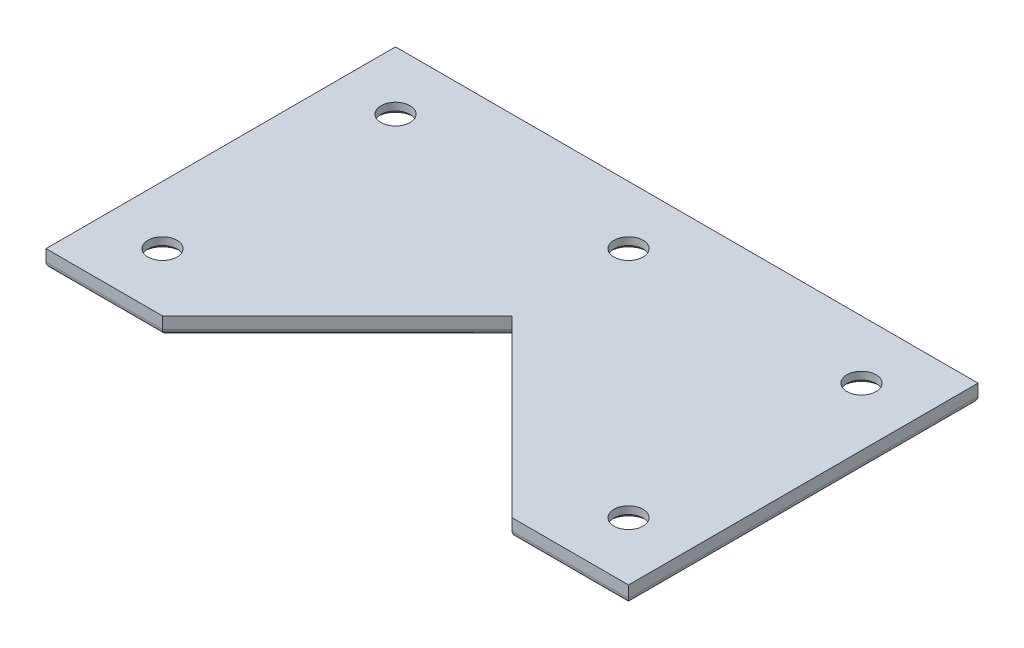
ISO-10303-21;
HEADER;
FILE_DESCRIPTION(('STEP AP214'),'2;1');
FILE_NAME('part.step','',(''),(''),'','','');
FILE_SCHEMA(('AUTOMOTIVE_DESIGN { 1 0 10303 214 1 1 1 1 }'));
ENDSEC;
DATA;
#1=APPLICATION_CONTEXT('core data for automotive mechanical design processes');
#2=APPLICATION_PROTOCOL_DEFINITION('international standard','automotive_design',2000,#1);
#3=PRODUCT_CONTEXT('',#1,'mechanical');
#4=PRODUCT('Part','Part','',(#3));
#5=PRODUCT_RELATED_PRODUCT_CATEGORY('part','',(#4));
#6=PRODUCT_DEFINITION_FORMATION('','',#4);
#7=PRODUCT_DEFINITION_CONTEXT('part definition',#1,'design');
#8=PRODUCT_DEFINITION('design','',#6,#7);
#9=PRODUCT_DEFINITION_SHAPE('','',#8);
#10=(LENGTH_UNIT() NAMED_UNIT(*) SI_UNIT(.MILLI.,.METRE.));
#11=(NAMED_UNIT(*) PLANE_ANGLE_UNIT() SI_UNIT($,.RADIAN.));
#12=(NAMED_UNIT(*) SI_UNIT($,.STERADIAN.) SOLID_ANGLE_UNIT());
#13=UNCERTAINTY_MEASURE_WITH_UNIT(LENGTH_MEASURE(1.E-05),#10,'distance_accuracy_value','');
#14=(GEOMETRIC_REPRESENTATION_CONTEXT(3) GLOBAL_UNCERTAINTY_ASSIGNED_CONTEXT((#13)) GLOBAL_UNIT_ASSIGNED_CONTEXT((#10,
#11,#12)) REPRESENTATION_CONTEXT('',''));
#15=CARTESIAN_POINT('',(0.,0.,0.));
#16=DIRECTION('',(0.,0.,1.));
#17=DIRECTION('',(1.,0.,0.));
#18=AXIS2_PLACEMENT_3D('',#15,#16,#17);
#19=CARTESIAN_POINT('',(-40.,3.,50.));
#20=DIRECTION('',(0.,-1.,0.));
#21=DIRECTION('',(0.,0.,-1.));
#22=AXIS2_PLACEMENT_3D('',#19,#20,#21);
#23=CYLINDRICAL_SURFACE('',#22,2.5);
#24=CARTESIAN_POINT('',(-40.,1.7,50.));
#25=DIRECTION('',(0.,-1.,0.));
#26=DIRECTION('',(0.,0.,-1.));
#27=AXIS2_PLACEMENT_3D('',#24,#25,#26);
#28=CIRCLE('',#27,2.5);
#29=CARTESIAN_POINT('',(-40.,1.7,47.5));
#30=VERTEX_POINT('',#29);
#31=EDGE_CURVE('E11',#30,#30,#28,.T.);
#32=ORIENTED_EDGE('',*,*,#31,.T.);
#33=EDGE_LOOP('',(#32));
#34=FACE_BOUND('',#33,.T.);
#35=CARTESIAN_POINT('',(-40.,3.,50.));
#36=DIRECTION('',(0.,-1.,0.));
#37=DIRECTION('',(0.,0.,-1.));
#38=AXIS2_PLACEMENT_3D('',#35,#36,#37);
#39=CIRCLE('',#38,2.5);
#40=CARTESIAN_POINT('',(-40.,3.,47.5));
#41=VERTEX_POINT('',#40);
#42=EDGE_CURVE('E24',#41,#41,#39,.T.);
#43=ORIENTED_EDGE('',*,*,#42,.F.);
#44=EDGE_LOOP('',(#43));
#45=FACE_BOUND('',#44,.T.);
#46=ADVANCED_FACE('F17',(#34,#45),#23,.F.);
#47=CARTESIAN_POINT('',(-40.,3.,10.));
#48=DIRECTION('',(0.,-1.,0.));
#49=DIRECTION('',(0.,0.,-1.));
#50=AXIS2_PLACEMENT_3D('',#47,#48,#49);
#51=CYLINDRICAL_SURFACE('',#50,2.5);
#52=CARTESIAN_POINT('',(-40.,1.7,10.));
#53=DIRECTION('',(0.,-1.,0.));
#54=DIRECTION('',(0.,0.,-1.));
#55=AXIS2_PLACEMENT_3D('',#52,#53,#54);
#56=CIRCLE('',#55,2.5);
#57=CARTESIAN_POINT('',(-40.,1.7,7.5));
#58=VERTEX_POINT('',#57);
#59=EDGE_CURVE('E211',#58,#58,#56,.T.);
#60=ORIENTED_EDGE('',*,*,#59,.T.);
#61=EDGE_LOOP('',(#60));
#62=FACE_BOUND('',#61,.T.);
#63=CARTESIAN_POINT('',(-40.,3.,10.));
#64=DIRECTION('',(0.,1.,0.));
#65=DIRECTION('',(0.,0.,-1.));
#66=AXIS2_PLACEMENT_3D('',#63,#64,#65);
#67=CIRCLE('',#66,2.5);
#68=CARTESIAN_POINT('',(-40.,3.,7.5));
#69=VERTEX_POINT('',#68);
#70=EDGE_CURVE('E208',#69,#69,#67,.T.);
#71=ORIENTED_EDGE('',*,*,#70,.T.);
#72=EDGE_LOOP('',(#71));
#73=FACE_BOUND('',#72,.T.);
#74=ADVANCED_FACE('F220',(#62,#73),#51,.F.);
#75=CARTESIAN_POINT('',(0.,3.,10.));
#76=DIRECTION('',(0.,-1.,0.));
#77=DIRECTION('',(0.,0.,-1.));
#78=AXIS2_PLACEMENT_3D('',#75,#76,#77);
#79=CYLINDRICAL_SURFACE('',#78,2.5);
#80=CARTESIAN_POINT('',(0.,1.7,10.));
#81=DIRECTION('',(0.,-1.,0.));
#82=DIRECTION('',(0.,0.,-1.));
#83=AXIS2_PLACEMENT_3D('',#80,#81,#82);
#84=CIRCLE('',#83,2.5);
#85=CARTESIAN_POINT('',(0.,1.7,7.5));
#86=VERTEX_POINT('',#85);
#87=EDGE_CURVE('E205',#86,#86,#84,.T.);
#88=ORIENTED_EDGE('',*,*,#87,.T.);
#89=EDGE_LOOP('',(#88));
#90=FACE_BOUND('',#89,.T.);
#91=CARTESIAN_POINT('',(0.,3.,10.));
#92=DIRECTION('',(0.,-1.,0.));
#93=DIRECTION('',(0.,0.,-1.));
#94=AXIS2_PLACEMENT_3D('',#91,#92,#93);
#95=CIRCLE('',#94,2.5);
#96=CARTESIAN_POINT('',(0.,3.,7.5));
#97=VERTEX_POINT('',#96);
#98=EDGE_CURVE('E202',#97,#97,#95,.T.);
#99=ORIENTED_EDGE('',*,*,#98,.F.);
#100=EDGE_LOOP('',(#99));
#101=FACE_BOUND('',#100,.T.);
#102=ADVANCED_FACE('F226',(#90,#101),#79,.F.);
#103=CARTESIAN_POINT('',(40.,3.,10.));
#104=DIRECTION('',(0.,-1.,0.));
#105=DIRECTION('',(0.,0.,-1.));
#106=AXIS2_PLACEMENT_3D('',#103,#104,#105);
#107=CYLINDRICAL_SURFACE('',#106,2.5);
#108=CARTESIAN_POINT('',(40.,1.7,10.));
#109=DIRECTION('',(0.,-1.,0.));
#110=DIRECTION('',(0.,0.,-1.));
#111=AXIS2_PLACEMENT_3D('',#108,#109,#110);
#112=CIRCLE('',#111,2.5);
#113=CARTESIAN_POINT('',(40.,1.7,7.5));
#114=VERTEX_POINT('',#113);
#115=EDGE_CURVE('E199',#114,#114,#112,.T.);
#116=ORIENTED_EDGE('',*,*,#115,.T.);
#117=EDGE_LOOP('',(#116));
#118=FACE_BOUND('',#117,.T.);
#119=CARTESIAN_POINT('',(40.,3.,10.));
#120=DIRECTION('',(0.,-1.,0.));
#121=DIRECTION('',(0.,0.,-1.));
#122=AXIS2_PLACEMENT_3D('',#119,#120,#121);
#123=CIRCLE('',#122,2.5);
#124=CARTESIAN_POINT('',(40.,3.,7.5));
#125=VERTEX_POINT('',#124);
#126=EDGE_CURVE('E196',#125,#125,#123,.T.);
#127=ORIENTED_EDGE('',*,*,#126,.F.);
#128=EDGE_LOOP('',(#127));
#129=FACE_BOUND('',#128,.T.);
#130=ADVANCED_FACE('F357',(#118,#129),#107,.F.);
#131=CARTESIAN_POINT('',(40.,3.,50.));
#132=DIRECTION('',(0.,-1.,0.));
#133=DIRECTION('',(0.,0.,-1.));
#134=AXIS2_PLACEMENT_3D('',#131,#132,#133);
#135=CYLINDRICAL_SURFACE('',#134,2.5);
#136=CARTESIAN_POINT('',(40.,1.7,50.));
#137=DIRECTION('',(0.,-1.,0.));
#138=DIRECTION('',(0.,0.,-1.));
#139=AXIS2_PLACEMENT_3D('',#136,#137,#138);
#140=CIRCLE('',#139,2.5);
#141=CARTESIAN_POINT('',(40.,1.7,47.5));
#142=VERTEX_POINT('',#141);
#143=EDGE_CURVE('E193',#142,#142,#140,.T.);
#144=ORIENTED_EDGE('',*,*,#143,.T.);
#145=EDGE_LOOP('',(#144));
#146=FACE_BOUND('',#145,.T.);
#147=CARTESIAN_POINT('',(40.,3.,50.));
#148=DIRECTION('',(0.,1.,0.));
#149=DIRECTION('',(0.,0.,-1.));
#150=AXIS2_PLACEMENT_3D('',#147,#148,#149);
#151=CIRCLE('',#150,2.5);
#152=CARTESIAN_POINT('',(40.,3.,47.5));
#153=VERTEX_POINT('',#152);
#154=EDGE_CURVE('E190',#153,#153,#151,.T.);
#155=ORIENTED_EDGE('',*,*,#154,.T.);
#156=EDGE_LOOP('',(#155));
#157=FACE_BOUND('',#156,.T.);
#158=ADVANCED_FACE('F354',(#146,#157),#135,.F.);
#159=CARTESIAN_POINT('',(-50.,3.,30.));
#160=DIRECTION('',(1.,0.,0.));
#161=DIRECTION('',(0.,0.,-1.));
#162=AXIS2_PLACEMENT_3D('',#159,#160,#161);
#163=PLANE('',#162);
#164=DIRECTION('',(0.,-1.,0.));
#165=VECTOR('',#164,1.);
#166=CARTESIAN_POINT('',(-50.,3.,0.));
#167=LINE('',#166,#165);
#168=CARTESIAN_POINT('',(-50.,3.,0.));
#169=VERTEX_POINT('',#168);
#170=CARTESIAN_POINT('',(-50.,1.,0.));
#171=VERTEX_POINT('',#170);
#172=EDGE_CURVE('E31',#169,#171,#167,.T.);
#173=ORIENTED_EDGE('',*,*,#172,.T.);
#174=DIRECTION('',(0.,0.,1.));
#175=VECTOR('',#174,1.);
#176=CARTESIAN_POINT('',(-50.,1.,60.));
#177=LINE('',#176,#175);
#178=CARTESIAN_POINT('',(-50.,1.,60.));
#179=VERTEX_POINT('',#178);
#180=EDGE_CURVE('E36',#171,#179,#177,.T.);
#181=ORIENTED_EDGE('',*,*,#180,.T.);
#182=DIRECTION('',(0.,-1.,0.));
#183=VECTOR('',#182,1.);
#184=CARTESIAN_POINT('',(-50.,3.,60.));
#185=LINE('',#184,#183);
#186=CARTESIAN_POINT('',(-50.,3.,60.));
#187=VERTEX_POINT('',#186);
#188=EDGE_CURVE('E186',#187,#179,#185,.T.);
#189=ORIENTED_EDGE('',*,*,#188,.F.);
#190=DIRECTION('',(0.,0.,1.));
#191=VECTOR('',#190,1.);
#192=CARTESIAN_POINT('',(-50.,3.,30.));
#193=LINE('',#192,#191);
#194=EDGE_CURVE('E183',#169,#187,#193,.T.);
#195=ORIENTED_EDGE('',*,*,#194,.F.);
#196=EDGE_LOOP('',(#173,#181,#189,#195));
#197=FACE_BOUND('',#196,.T.);
#198=ADVANCED_FACE('F350',(#197),#163,.F.);
#199=CARTESIAN_POINT('',(0.,3.,0.));
#200=DIRECTION('',(0.,0.,-1.));
#201=DIRECTION('',(-1.,0.,0.));
#202=AXIS2_PLACEMENT_3D('',#199,#200,#201);
#203=PLANE('',#202);
#204=DIRECTION('',(0.,-1.,0.));
#205=VECTOR('',#204,1.);
#206=CARTESIAN_POINT('',(50.,3.,0.));
#207=LINE('',#206,#205);
#208=CARTESIAN_POINT('',(50.,3.,0.));
#209=VERTEX_POINT('',#208);
#210=CARTESIAN_POINT('',(50.,1.,0.));
#211=VERTEX_POINT('',#210);
#212=EDGE_CURVE('E181',#209,#211,#207,.T.);
#213=ORIENTED_EDGE('',*,*,#212,.T.);
#214=DIRECTION('',(1.,0.,0.));
#215=VECTOR('',#214,1.);
#216=CARTESIAN_POINT('',(0.,1.,0.));
#217=LINE('',#216,#215);
#218=EDGE_CURVE('E179',#211,#171,#217,.F.);
#219=ORIENTED_EDGE('',*,*,#218,.T.);
#220=ORIENTED_EDGE('',*,*,#172,.F.);
#221=DIRECTION('',(1.,0.,0.));
#222=VECTOR('',#221,1.);
#223=CARTESIAN_POINT('',(0.,3.,0.));
#224=LINE('',#223,#222);
#225=EDGE_CURVE('E177',#169,#209,#224,.T.);
#226=ORIENTED_EDGE('',*,*,#225,.T.);
#227=EDGE_LOOP('',(#213,#219,#220,#226));
#228=FACE_BOUND('',#227,.T.);
#229=ADVANCED_FACE('F346',(#228),#203,.T.);
#230=CARTESIAN_POINT('',(50.,3.,30.));
#231=DIRECTION('',(1.,0.,0.));
#232=DIRECTION('',(0.,0.,-1.));
#233=AXIS2_PLACEMENT_3D('',#230,#231,#232);
#234=PLANE('',#233);
#235=DIRECTION('',(0.,-1.,0.));
#236=VECTOR('',#235,1.);
#237=CARTESIAN_POINT('',(50.,3.,60.));
#238=LINE('',#237,#236);
#239=CARTESIAN_POINT('',(50.,3.,60.));
#240=VERTEX_POINT('',#239);
#241=CARTESIAN_POINT('',(50.,1.,60.));
#242=VERTEX_POINT('',#241);
#243=EDGE_CURVE('E175',#240,#242,#238,.T.);
#244=ORIENTED_EDGE('',*,*,#243,.T.);
#245=DIRECTION('',(0.,0.,1.));
#246=VECTOR('',#245,1.);
#247=CARTESIAN_POINT('',(50.,1.,30.));
#248=LINE('',#247,#246);
#249=EDGE_CURVE('E172',#242,#211,#248,.F.);
#250=ORIENTED_EDGE('',*,*,#249,.T.);
#251=ORIENTED_EDGE('',*,*,#212,.F.);
#252=DIRECTION('',(0.,0.,1.));
#253=VECTOR('',#252,1.);
#254=CARTESIAN_POINT('',(50.,3.,30.));
#255=LINE('',#254,#253);
#256=EDGE_CURVE('E170',#209,#240,#255,.T.);
#257=ORIENTED_EDGE('',*,*,#256,.T.);
#258=EDGE_LOOP('',(#244,#250,#251,#257));
#259=FACE_BOUND('',#258,.T.);
#260=ADVANCED_FACE('F342',(#259),#234,.T.);
#261=CARTESIAN_POINT('',(40.,3.,60.));
#262=DIRECTION('',(0.,0.,1.));
#263=DIRECTION('',(1.,0.,0.));
#264=AXIS2_PLACEMENT_3D('',#261,#262,#263);
#265=PLANE('',#264);
#266=DIRECTION('',(0.,-1.,0.));
#267=VECTOR('',#266,1.);
#268=CARTESIAN_POINT('',(30.,3.,60.));
#269=LINE('',#268,#267);
#270=CARTESIAN_POINT('',(30.,3.,60.));
#271=VERTEX_POINT('',#270);
#272=CARTESIAN_POINT('',(30.,1.,60.));
#273=VERTEX_POINT('',#272);
#274=EDGE_CURVE('E168',#271,#273,#269,.T.);
#275=ORIENTED_EDGE('',*,*,#274,.T.);
#276=DIRECTION('',(-1.,0.,0.));
#277=VECTOR('',#276,1.);
#278=CARTESIAN_POINT('',(40.,1.,60.));
#279=LINE('',#278,#277);
#280=EDGE_CURVE('E112',#273,#242,#279,.F.);
#281=ORIENTED_EDGE('',*,*,#280,.T.);
#282=ORIENTED_EDGE('',*,*,#243,.F.);
#283=DIRECTION('',(-1.,0.,0.));
#284=VECTOR('',#283,1.);
#285=CARTESIAN_POINT('',(40.,3.,60.));
#286=LINE('',#285,#284);
#287=EDGE_CURVE('E165',#240,#271,#286,.T.);
#288=ORIENTED_EDGE('',*,*,#287,.T.);
#289=EDGE_LOOP('',(#275,#281,#282,#288));
#290=FACE_BOUND('',#289,.T.);
#291=ADVANCED_FACE('F338',(#290),#265,.T.);
#292=CARTESIAN_POINT('',(15.,3.,45.));
#293=DIRECTION('',(0.707106781186548,0.,-0.707106781186548));
#294=DIRECTION('',(-0.707106781186548,0.,-0.707106781186548));
#295=AXIS2_PLACEMENT_3D('',#292,#293,#294);
#296=PLANE('',#295);
#297=DIRECTION('',(0.,-1.,0.));
#298=VECTOR('',#297,1.);
#299=CARTESIAN_POINT('',(0.,3.,30.));
#300=LINE('',#299,#298);
#301=CARTESIAN_POINT('',(0.,3.,30.));
#302=VERTEX_POINT('',#301);
#303=CARTESIAN_POINT('',(0.,1.,30.));
#304=VERTEX_POINT('',#303);
#305=EDGE_CURVE('E163',#302,#304,#300,.T.);
#306=ORIENTED_EDGE('',*,*,#305,.T.);
#307=DIRECTION('',(0.707106781186548,0.,0.707106781186548));
#308=VECTOR('',#307,1.);
#309=CARTESIAN_POINT('',(30.,1.,60.));
#310=LINE('',#309,#308);
#311=EDGE_CURVE('E160',#304,#273,#310,.T.);
#312=ORIENTED_EDGE('',*,*,#311,.T.);
#313=ORIENTED_EDGE('',*,*,#274,.F.);
#314=DIRECTION('',(0.707106781186548,0.,0.707106781186548));
#315=VECTOR('',#314,1.);
#316=CARTESIAN_POINT('',(15.,3.,45.));
#317=LINE('',#316,#315);
#318=EDGE_CURVE('E157',#302,#271,#317,.T.);
#319=ORIENTED_EDGE('',*,*,#318,.F.);
#320=EDGE_LOOP('',(#306,#312,#313,#319));
#321=FACE_BOUND('',#320,.T.);
#322=ADVANCED_FACE('F334',(#321),#296,.F.);
#323=CARTESIAN_POINT('',(-15.,3.,45.));
#324=DIRECTION('',(-0.707106781186547,0.,-0.707106781186548));
#325=DIRECTION('',(-0.707106781186548,0.,0.707106781186547));
#326=AXIS2_PLACEMENT_3D('',#323,#324,#325);
#327=PLANE('',#326);
#328=DIRECTION('',(0.,-1.,0.));
#329=VECTOR('',#328,1.);
#330=CARTESIAN_POINT('',(-30.,3.,60.));
#331=LINE('',#330,#329);
#332=CARTESIAN_POINT('',(-30.,3.,60.));
#333=VERTEX_POINT('',#332);
#334=CARTESIAN_POINT('',(-30.,1.,60.));
#335=VERTEX_POINT('',#334);
#336=EDGE_CURVE('E155',#333,#335,#331,.T.);
#337=ORIENTED_EDGE('',*,*,#336,.T.);
#338=DIRECTION('',(0.707106781186548,0.,-0.707106781186547));
#339=VECTOR('',#338,1.);
#340=CARTESIAN_POINT('',(0.,1.,30.));
#341=LINE('',#340,#339);
#342=EDGE_CURVE('E152',#335,#304,#341,.T.);
#343=ORIENTED_EDGE('',*,*,#342,.T.);
#344=ORIENTED_EDGE('',*,*,#305,.F.);
#345=DIRECTION('',(0.707106781186548,0.,-0.707106781186547));
#346=VECTOR('',#345,1.);
#347=CARTESIAN_POINT('',(-15.,3.,45.));
#348=LINE('',#347,#346);
#349=EDGE_CURVE('E149',#333,#302,#348,.T.);
#350=ORIENTED_EDGE('',*,*,#349,.F.);
#351=EDGE_LOOP('',(#337,#343,#344,#350));
#352=FACE_BOUND('',#351,.T.);
#353=ADVANCED_FACE('F330',(#352),#327,.F.);
#354=CARTESIAN_POINT('',(-40.,3.,60.));
#355=DIRECTION('',(0.,0.,-1.));
#356=DIRECTION('',(-1.,0.,0.));
#357=AXIS2_PLACEMENT_3D('',#354,#355,#356);
#358=PLANE('',#357);
#359=ORIENTED_EDGE('',*,*,#188,.T.);
#360=DIRECTION('',(1.,0.,0.));
#361=VECTOR('',#360,1.);
#362=CARTESIAN_POINT('',(-30.,1.,60.));
#363=LINE('',#362,#361);
#364=EDGE_CURVE('E146',#179,#335,#363,.T.);
#365=ORIENTED_EDGE('',*,*,#364,.T.);
#366=ORIENTED_EDGE('',*,*,#336,.F.);
#367=DIRECTION('',(1.,0.,0.));
#368=VECTOR('',#367,1.);
#369=CARTESIAN_POINT('',(-40.,3.,60.));
#370=LINE('',#369,#368);
#371=EDGE_CURVE('E143',#187,#333,#370,.T.);
#372=ORIENTED_EDGE('',*,*,#371,.F.);
#373=EDGE_LOOP('',(#359,#365,#366,#372));
#374=FACE_BOUND('',#373,.T.);
#375=ADVANCED_FACE('F326',(#374),#358,.F.);
#376=CARTESIAN_POINT('',(0.,3.,30.));
#377=DIRECTION('',(0.,-1.,0.));
#378=DIRECTION('',(1.,0.,0.));
#379=AXIS2_PLACEMENT_3D('',#376,#377,#378);
#380=PLANE('',#379);
#381=ORIENTED_EDGE('',*,*,#154,.F.);
#382=EDGE_LOOP('',(#381));
#383=FACE_BOUND('',#382,.T.);
#384=ORIENTED_EDGE('',*,*,#126,.T.);
#385=EDGE_LOOP('',(#384));
#386=FACE_BOUND('',#385,.T.);
#387=ORIENTED_EDGE('',*,*,#98,.T.);
#388=EDGE_LOOP('',(#387));
#389=FACE_BOUND('',#388,.T.);
#390=ORIENTED_EDGE('',*,*,#70,.F.);
#391=EDGE_LOOP('',(#390));
#392=FACE_BOUND('',#391,.T.);
#393=ORIENTED_EDGE('',*,*,#42,.T.);
#394=EDGE_LOOP('',(#393));
#395=FACE_BOUND('',#394,.T.);
#396=ORIENTED_EDGE('',*,*,#194,.T.);
#397=ORIENTED_EDGE('',*,*,#371,.T.);
#398=ORIENTED_EDGE('',*,*,#349,.T.);
#399=ORIENTED_EDGE('',*,*,#318,.T.);
#400=ORIENTED_EDGE('',*,*,#287,.F.);
#401=ORIENTED_EDGE('',*,*,#256,.F.);
#402=ORIENTED_EDGE('',*,*,#225,.F.);
#403=EDGE_LOOP('',(#396,#397,#398,#399,#400,#401,#402));
#404=FACE_BOUND('',#403,.T.);
#405=ADVANCED_FACE('F216',(#383,#386,#389,#392,#395,#404),#380,.F.);
#406=CARTESIAN_POINT('',(0.,0.,30.));
#407=DIRECTION('',(0.,-1.,0.));
#408=DIRECTION('',(1.,0.,0.));
#409=AXIS2_PLACEMENT_3D('',#406,#407,#408);
#410=PLANE('',#409);
#411=CARTESIAN_POINT('',(40.,0.,50.));
#412=DIRECTION('',(0.,-1.,0.));
#413=DIRECTION('',(0.,0.,-1.));
#414=AXIS2_PLACEMENT_3D('',#411,#412,#413);
#415=CIRCLE('',#414,4.95);
#416=CARTESIAN_POINT('',(40.,0.,45.05));
#417=VERTEX_POINT('',#416);
#418=EDGE_CURVE('E140',#417,#417,#415,.F.);
#419=ORIENTED_EDGE('',*,*,#418,.T.);
#420=EDGE_LOOP('',(#419));
#421=FACE_BOUND('',#420,.T.);
#422=CARTESIAN_POINT('',(40.,0.,10.));
#423=DIRECTION('',(0.,-1.,0.));
#424=DIRECTION('',(0.,0.,-1.));
#425=AXIS2_PLACEMENT_3D('',#422,#423,#424);
#426=CIRCLE('',#425,4.95);
#427=CARTESIAN_POINT('',(40.,0.,5.05));
#428=VERTEX_POINT('',#427);
#429=EDGE_CURVE('E137',#428,#428,#426,.F.);
#430=ORIENTED_EDGE('',*,*,#429,.T.);
#431=EDGE_LOOP('',(#430));
#432=FACE_BOUND('',#431,.T.);
#433=CARTESIAN_POINT('',(0.,0.,10.));
#434=DIRECTION('',(0.,-1.,0.));
#435=DIRECTION('',(0.,0.,-1.));
#436=AXIS2_PLACEMENT_3D('',#433,#434,#435);
#437=CIRCLE('',#436,4.95);
#438=CARTESIAN_POINT('',(0.,0.,5.05));
#439=VERTEX_POINT('',#438);
#440=EDGE_CURVE('E134',#439,#439,#437,.F.);
#441=ORIENTED_EDGE('',*,*,#440,.T.);
#442=EDGE_LOOP('',(#441));
#443=FACE_BOUND('',#442,.T.);
#444=CARTESIAN_POINT('',(-40.,0.,50.));
#445=DIRECTION('',(0.,-1.,0.));
#446=DIRECTION('',(0.,0.,-1.));
#447=AXIS2_PLACEMENT_3D('',#444,#445,#446);
#448=CIRCLE('',#447,4.95);
#449=CARTESIAN_POINT('',(-40.,0.,45.05));
#450=VERTEX_POINT('',#449);
#451=EDGE_CURVE('E126',#450,#450,#448,.F.);
#452=ORIENTED_EDGE('',*,*,#451,.T.);
#453=EDGE_LOOP('',(#452));
#454=FACE_BOUND('',#453,.T.);
#455=CARTESIAN_POINT('',(-40.,0.,10.));
#456=DIRECTION('',(0.,-1.,0.));
#457=DIRECTION('',(0.,0.,-1.));
#458=AXIS2_PLACEMENT_3D('',#455,#456,#457);
#459=CIRCLE('',#458,4.95);
#460=CARTESIAN_POINT('',(-40.,0.,5.05));
#461=VERTEX_POINT('',#460);
#462=EDGE_CURVE('E122',#461,#461,#459,.F.);
#463=ORIENTED_EDGE('',*,*,#462,.T.);
#464=EDGE_LOOP('',(#463));
#465=FACE_BOUND('',#464,.T.);
#466=DIRECTION('',(0.707106781186548,0.,0.707106781186548));
#467=VECTOR('',#466,1.);
#468=CARTESIAN_POINT('',(0.707106781186533,0.,29.2928932188135));
#469=LINE('',#468,#467);
#470=CARTESIAN_POINT('',(30.4142135623731,0.,59.));
#471=VERTEX_POINT('',#470);
#472=CARTESIAN_POINT('',(0.,0.,28.5857864376269));
#473=VERTEX_POINT('',#472);
#474=EDGE_CURVE('E98',#471,#473,#469,.F.);
#475=ORIENTED_EDGE('',*,*,#474,.T.);
#476=DIRECTION('',(0.707106781186548,0.,-0.707106781186547));
#477=VECTOR('',#476,1.);
#478=CARTESIAN_POINT('',(-30.7071067811865,0.,59.2928932188134));
#479=LINE('',#478,#477);
#480=CARTESIAN_POINT('',(-30.4142135623731,0.,59.));
#481=VERTEX_POINT('',#480);
#482=EDGE_CURVE('E123',#473,#481,#479,.F.);
#483=ORIENTED_EDGE('',*,*,#482,.T.);
#484=DIRECTION('',(1.,0.,0.));
#485=VECTOR('',#484,1.);
#486=CARTESIAN_POINT('',(-50.,0.,59.));
#487=LINE('',#486,#485);
#488=CARTESIAN_POINT('',(-49.,0.,59.));
#489=VERTEX_POINT('',#488);
#490=EDGE_CURVE('E128',#481,#489,#487,.F.);
#491=ORIENTED_EDGE('',*,*,#490,.T.);
#492=DIRECTION('',(0.,0.,1.));
#493=VECTOR('',#492,1.);
#494=CARTESIAN_POINT('',(-49.,0.,0.));
#495=LINE('',#494,#493);
#496=CARTESIAN_POINT('',(-49.,0.,1.));
#497=VERTEX_POINT('',#496);
#498=EDGE_CURVE('E627',#489,#497,#495,.F.);
#499=ORIENTED_EDGE('',*,*,#498,.T.);
#500=DIRECTION('',(1.,0.,0.));
#501=VECTOR('',#500,1.);
#502=CARTESIAN_POINT('',(0.,0.,1.));
#503=LINE('',#502,#501);
#504=CARTESIAN_POINT('',(49.,0.,1.));
#505=VERTEX_POINT('',#504);
#506=EDGE_CURVE('E625',#497,#505,#503,.T.);
#507=ORIENTED_EDGE('',*,*,#506,.T.);
#508=DIRECTION('',(0.,0.,1.));
#509=VECTOR('',#508,1.);
#510=CARTESIAN_POINT('',(49.,0.,30.));
#511=LINE('',#510,#509);
#512=CARTESIAN_POINT('',(49.,0.,59.));
#513=VERTEX_POINT('',#512);
#514=EDGE_CURVE('E101',#505,#513,#511,.T.);
#515=ORIENTED_EDGE('',*,*,#514,.T.);
#516=DIRECTION('',(-1.,0.,0.));
#517=VECTOR('',#516,1.);
#518=CARTESIAN_POINT('',(0.,0.,59.));
#519=LINE('',#518,#517);
#520=EDGE_CURVE('E94',#513,#471,#519,.T.);
#521=ORIENTED_EDGE('',*,*,#520,.T.);
#522=EDGE_LOOP('',(#475,#483,#491,#499,#507,#515,#521));
#523=FACE_BOUND('',#522,.T.);
#524=ADVANCED_FACE('F96',(#421,#432,#443,#454,#465,#523),#410,.T.);
#525=CARTESIAN_POINT('',(0.,1.,1.));
#526=DIRECTION('',(1.,0.,0.));
#527=DIRECTION('',(0.,0.,-1.));
#528=AXIS2_PLACEMENT_3D('',#525,#526,#527);
#529=CYLINDRICAL_SURFACE('',#528,1.);
#530=CARTESIAN_POINT('',(-49.,1.,1.));
#531=DIRECTION('',(0.707106781186548,0.,-0.707106781186548));
#532=DIRECTION('',(-0.707106781186548,0.,-0.707106781186548));
#533=AXIS2_PLACEMENT_3D('',#530,#531,#532);
#534=ELLIPSE('',#533,1.41421356237309,1.);
#535=EDGE_CURVE('E105',#171,#497,#534,.F.);
#536=ORIENTED_EDGE('',*,*,#535,.F.);
#537=ORIENTED_EDGE('',*,*,#218,.F.);
#538=CARTESIAN_POINT('',(49.,1.,1.));
#539=DIRECTION('',(0.707106781186548,0.,0.707106781186548));
#540=DIRECTION('',(0.707106781186548,0.,-0.707106781186548));
#541=AXIS2_PLACEMENT_3D('',#538,#539,#540);
#542=ELLIPSE('',#541,1.41421356237309,1.);
#543=EDGE_CURVE('E619',#505,#211,#542,.T.);
#544=ORIENTED_EDGE('',*,*,#543,.F.);
#545=ORIENTED_EDGE('',*,*,#506,.F.);
#546=EDGE_LOOP('',(#536,#537,#544,#545));
#547=FACE_BOUND('',#546,.T.);
#548=ADVANCED_FACE('F316',(#547),#529,.T.);
#549=CARTESIAN_POINT('',(49.,1.,30.));
#550=DIRECTION('',(0.,0.,1.));
#551=DIRECTION('',(1.,0.,0.));
#552=AXIS2_PLACEMENT_3D('',#549,#550,#551);
#553=CYLINDRICAL_SURFACE('',#552,1.);
#554=ORIENTED_EDGE('',*,*,#543,.T.);
#555=ORIENTED_EDGE('',*,*,#249,.F.);
#556=CARTESIAN_POINT('',(49.,1.,59.));
#557=DIRECTION('',(-0.707106781186548,0.,0.707106781186548));
#558=DIRECTION('',(0.707106781186548,0.,0.707106781186548));
#559=AXIS2_PLACEMENT_3D('',#556,#557,#558);
#560=ELLIPSE('',#559,1.41421356237309,1.);
#561=EDGE_CURVE('E617',#513,#242,#560,.T.);
#562=ORIENTED_EDGE('',*,*,#561,.F.);
#563=ORIENTED_EDGE('',*,*,#514,.F.);
#564=EDGE_LOOP('',(#554,#555,#562,#563));
#565=FACE_BOUND('',#564,.T.);
#566=ADVANCED_FACE('F312',(#565),#553,.T.);
#567=CARTESIAN_POINT('',(-49.,1.,30.));
#568=DIRECTION('',(0.,0.,-1.));
#569=DIRECTION('',(-1.,0.,0.));
#570=AXIS2_PLACEMENT_3D('',#567,#568,#569);
#571=CYLINDRICAL_SURFACE('',#570,1.);
#572=ORIENTED_EDGE('',*,*,#535,.T.);
#573=ORIENTED_EDGE('',*,*,#498,.F.);
#574=CARTESIAN_POINT('',(-49.,1.,59.));
#575=DIRECTION('',(-0.707106781186548,0.,-0.707106781186548));
#576=DIRECTION('',(-0.707106781186548,0.,0.707106781186548));
#577=AXIS2_PLACEMENT_3D('',#574,#575,#576);
#578=ELLIPSE('',#577,1.41421356237309,1.);
#579=EDGE_CURVE('E115',#179,#489,#578,.F.);
#580=ORIENTED_EDGE('',*,*,#579,.F.);
#581=ORIENTED_EDGE('',*,*,#180,.F.);
#582=EDGE_LOOP('',(#572,#573,#580,#581));
#583=FACE_BOUND('',#582,.T.);
#584=ADVANCED_FACE('F309',(#583),#571,.T.);
#585=CARTESIAN_POINT('',(0.,1.,59.));
#586=DIRECTION('',(-1.,0.,0.));
#587=DIRECTION('',(0.,0.,1.));
#588=AXIS2_PLACEMENT_3D('',#585,#586,#587);
#589=CYLINDRICAL_SURFACE('',#588,1.);
#590=ORIENTED_EDGE('',*,*,#561,.T.);
#591=ORIENTED_EDGE('',*,*,#280,.F.);
#592=CARTESIAN_POINT('',(30.4142135623731,1.,59.));
#593=DIRECTION('',(-0.923879532511287,0.,-0.38268343236509));
#594=DIRECTION('',(-0.38268343236509,0.,0.923879532511287));
#595=AXIS2_PLACEMENT_3D('',#592,#593,#594);
#596=ELLIPSE('',#595,1.08239220029239,1.);
#597=EDGE_CURVE('E109',#471,#273,#596,.T.);
#598=ORIENTED_EDGE('',*,*,#597,.F.);
#599=ORIENTED_EDGE('',*,*,#520,.F.);
#600=EDGE_LOOP('',(#590,#591,#598,#599));
#601=FACE_BOUND('',#600,.T.);
#602=ADVANCED_FACE('F110',(#601),#589,.T.);
#603=CARTESIAN_POINT('',(-40.,1.,59.));
#604=DIRECTION('',(-1.,0.,0.));
#605=DIRECTION('',(0.,0.,1.));
#606=AXIS2_PLACEMENT_3D('',#603,#604,#605);
#607=CYLINDRICAL_SURFACE('',#606,1.);
#608=ORIENTED_EDGE('',*,*,#579,.T.);
#609=ORIENTED_EDGE('',*,*,#490,.F.);
#610=CARTESIAN_POINT('',(-30.4142135623731,1.,59.));
#611=DIRECTION('',(-0.923879532511287,0.,0.38268343236509));
#612=DIRECTION('',(-0.38268343236509,0.,-0.923879532511287));
#613=AXIS2_PLACEMENT_3D('',#610,#611,#612);
#614=ELLIPSE('',#613,1.08239220029239,1.);
#615=EDGE_CURVE('E116',#335,#481,#614,.F.);
#616=ORIENTED_EDGE('',*,*,#615,.F.);
#617=ORIENTED_EDGE('',*,*,#364,.F.);
#618=EDGE_LOOP('',(#608,#609,#616,#617));
#619=FACE_BOUND('',#618,.T.);
#620=ADVANCED_FACE('F303',(#619),#607,.T.);
#621=CARTESIAN_POINT('',(15.7071067811866,1.,44.2928932188135));
#622=DIRECTION('',(-0.707106781186548,0.,-0.707106781186548));
#623=DIRECTION('',(-0.707106781186548,0.,0.707106781186548));
#624=AXIS2_PLACEMENT_3D('',#621,#622,#623);
#625=CYLINDRICAL_SURFACE('',#624,1.);
#626=ORIENTED_EDGE('',*,*,#597,.T.);
#627=ORIENTED_EDGE('',*,*,#311,.F.);
#628=CARTESIAN_POINT('',(0.,1.,28.5857864376269));
#629=DIRECTION('',(-1.,0.,0.));
#630=DIRECTION('',(0.,0.,1.));
#631=AXIS2_PLACEMENT_3D('',#628,#629,#630);
#632=ELLIPSE('',#631,1.41421356237309,1.);
#633=EDGE_CURVE('E120',#473,#304,#632,.T.);
#634=ORIENTED_EDGE('',*,*,#633,.F.);
#635=ORIENTED_EDGE('',*,*,#474,.F.);
#636=EDGE_LOOP('',(#626,#627,#634,#635));
#637=FACE_BOUND('',#636,.T.);
#638=ADVANCED_FACE('F118',(#637),#625,.T.);
#639=CARTESIAN_POINT('',(-15.7071067811866,1.,44.2928932188135));
#640=DIRECTION('',(-0.707106781186548,0.,0.707106781186547));
#641=DIRECTION('',(0.707106781186547,0.,0.707106781186548));
#642=AXIS2_PLACEMENT_3D('',#639,#640,#641);
#643=CYLINDRICAL_SURFACE('',#642,1.);
#644=ORIENTED_EDGE('',*,*,#615,.T.);
#645=ORIENTED_EDGE('',*,*,#482,.F.);
#646=ORIENTED_EDGE('',*,*,#633,.T.);
#647=ORIENTED_EDGE('',*,*,#342,.F.);
#648=EDGE_LOOP('',(#644,#645,#646,#647));
#649=FACE_BOUND('',#648,.T.);
#650=ADVANCED_FACE('F296',(#649),#643,.T.);
#651=CARTESIAN_POINT('',(-40.,1.,10.));
#652=DIRECTION('',(0.,-1.,0.));
#653=DIRECTION('',(0.,0.,-1.));
#654=AXIS2_PLACEMENT_3D('',#651,#652,#653);
#655=CYLINDRICAL_SURFACE('',#654,4.25);
#656=CARTESIAN_POINT('',(-40.,0.7,10.));
#657=DIRECTION('',(0.,-1.,0.));
#658=DIRECTION('',(0.,0.,-1.));
#659=AXIS2_PLACEMENT_3D('',#656,#657,#658);
#660=CIRCLE('',#659,4.25);
#661=CARTESIAN_POINT('',(-40.,0.7,5.75));
#662=VERTEX_POINT('',#661);
#663=EDGE_CURVE('E604',#662,#662,#660,.T.);
#664=ORIENTED_EDGE('',*,*,#663,.T.);
#665=EDGE_LOOP('',(#664));
#666=FACE_BOUND('',#665,.T.);
#667=CARTESIAN_POINT('',(-40.,1.,10.));
#668=DIRECTION('',(0.,-1.,0.));
#669=DIRECTION('',(0.,0.,-1.));
#670=AXIS2_PLACEMENT_3D('',#667,#668,#669);
#671=CIRCLE('',#670,4.25);
#672=CARTESIAN_POINT('',(-40.,1.,5.75));
#673=VERTEX_POINT('',#672);
#674=EDGE_CURVE('E605',#673,#673,#671,.T.);
#675=ORIENTED_EDGE('',*,*,#674,.F.);
#676=EDGE_LOOP('',(#675));
#677=FACE_BOUND('',#676,.T.);
#678=ADVANCED_FACE('F292',(#666,#677),#655,.F.);
#679=CARTESIAN_POINT('',(0.,1.,30.));
#680=DIRECTION('',(0.,-1.,0.));
#681=DIRECTION('',(1.,0.,0.));
#682=AXIS2_PLACEMENT_3D('',#679,#680,#681);
#683=PLANE('',#682);
#684=CARTESIAN_POINT('',(-40.,1.,10.));
#685=DIRECTION('',(0.,-1.,0.));
#686=DIRECTION('',(0.,0.,-1.));
#687=AXIS2_PLACEMENT_3D('',#684,#685,#686);
#688=CIRCLE('',#687,3.2);
#689=CARTESIAN_POINT('',(-40.,1.,6.8));
#690=VERTEX_POINT('',#689);
#691=EDGE_CURVE('E609',#690,#690,#688,.F.);
#692=ORIENTED_EDGE('',*,*,#691,.T.);
#693=EDGE_LOOP('',(#692));
#694=FACE_BOUND('',#693,.T.);
#695=ORIENTED_EDGE('',*,*,#674,.T.);
#696=EDGE_LOOP('',(#695));
#697=FACE_BOUND('',#696,.T.);
#698=ADVANCED_FACE('F288',(#694,#697),#683,.T.);
#699=CARTESIAN_POINT('',(-40.,1.,50.));
#700=DIRECTION('',(0.,-1.,0.));
#701=DIRECTION('',(0.,0.,-1.));
#702=AXIS2_PLACEMENT_3D('',#699,#700,#701);
#703=CYLINDRICAL_SURFACE('',#702,4.25);
#704=CARTESIAN_POINT('',(-40.,0.7,50.));
#705=DIRECTION('',(0.,-1.,0.));
#706=DIRECTION('',(0.,0.,-1.));
#707=AXIS2_PLACEMENT_3D('',#704,#705,#706);
#708=CIRCLE('',#707,4.25);
#709=CARTESIAN_POINT('',(-40.,0.7,45.75));
#710=VERTEX_POINT('',#709);
#711=EDGE_CURVE('E650',#710,#710,#708,.T.);
#712=ORIENTED_EDGE('',*,*,#711,.T.);
#713=EDGE_LOOP('',(#712));
#714=FACE_BOUND('',#713,.T.);
#715=CARTESIAN_POINT('',(-40.,1.,50.));
#716=DIRECTION('',(0.,-1.,0.));
#717=DIRECTION('',(0.,0.,-1.));
#718=AXIS2_PLACEMENT_3D('',#715,#716,#717);
#719=CIRCLE('',#718,4.25);
#720=CARTESIAN_POINT('',(-40.,1.,45.75));
#721=VERTEX_POINT('',#720);
#722=EDGE_CURVE('E653',#721,#721,#719,.T.);
#723=ORIENTED_EDGE('',*,*,#722,.F.);
#724=EDGE_LOOP('',(#723));
#725=FACE_BOUND('',#724,.T.);
#726=ADVANCED_FACE('F284',(#714,#725),#703,.F.);
#727=CARTESIAN_POINT('',(0.,1.,30.));
#728=DIRECTION('',(0.,-1.,0.));
#729=DIRECTION('',(1.,0.,0.));
#730=AXIS2_PLACEMENT_3D('',#727,#728,#729);
#731=PLANE('',#730);
#732=CARTESIAN_POINT('',(-40.,1.,50.));
#733=DIRECTION('',(0.,-1.,0.));
#734=DIRECTION('',(0.,0.,-1.));
#735=AXIS2_PLACEMENT_3D('',#732,#733,#734);
#736=CIRCLE('',#735,3.2);
#737=CARTESIAN_POINT('',(-40.,1.,46.8));
#738=VERTEX_POINT('',#737);
#739=EDGE_CURVE('E656',#738,#738,#736,.F.);
#740=ORIENTED_EDGE('',*,*,#739,.T.);
#741=EDGE_LOOP('',(#740));
#742=FACE_BOUND('',#741,.T.);
#743=ORIENTED_EDGE('',*,*,#722,.T.);
#744=EDGE_LOOP('',(#743));
#745=FACE_BOUND('',#744,.T.);
#746=ADVANCED_FACE('F280',(#742,#745),#731,.T.);
#747=CARTESIAN_POINT('',(40.,1.,50.));
#748=DIRECTION('',(0.,-1.,0.));
#749=DIRECTION('',(0.,0.,-1.));
#750=AXIS2_PLACEMENT_3D('',#747,#748,#749);
#751=CYLINDRICAL_SURFACE('',#750,4.25);
#752=CARTESIAN_POINT('',(40.,0.7,50.));
#753=DIRECTION('',(0.,-1.,0.));
#754=DIRECTION('',(0.,0.,-1.));
#755=AXIS2_PLACEMENT_3D('',#752,#753,#754);
#756=CIRCLE('',#755,4.25);
#757=CARTESIAN_POINT('',(40.,0.7,45.75));
#758=VERTEX_POINT('',#757);
#759=EDGE_CURVE('E659',#758,#758,#756,.T.);
#760=ORIENTED_EDGE('',*,*,#759,.T.);
#761=EDGE_LOOP('',(#760));
#762=FACE_BOUND('',#761,.T.);
#763=CARTESIAN_POINT('',(40.,1.,50.));
#764=DIRECTION('',(0.,-1.,0.));
#765=DIRECTION('',(0.,0.,-1.));
#766=AXIS2_PLACEMENT_3D('',#763,#764,#765);
#767=CIRCLE('',#766,4.25);
#768=CARTESIAN_POINT('',(40.,1.,45.75));
#769=VERTEX_POINT('',#768);
#770=EDGE_CURVE('E662',#769,#769,#767,.T.);
#771=ORIENTED_EDGE('',*,*,#770,.F.);
#772=EDGE_LOOP('',(#771));
#773=FACE_BOUND('',#772,.T.);
#774=ADVANCED_FACE('F276',(#762,#773),#751,.F.);
#775=CARTESIAN_POINT('',(0.,1.,30.));
#776=DIRECTION('',(0.,-1.,0.));
#777=DIRECTION('',(1.,0.,0.));
#778=AXIS2_PLACEMENT_3D('',#775,#776,#777);
#779=PLANE('',#778);
#780=CARTESIAN_POINT('',(40.,1.,50.));
#781=DIRECTION('',(0.,-1.,0.));
#782=DIRECTION('',(0.,0.,-1.));
#783=AXIS2_PLACEMENT_3D('',#780,#781,#782);
#784=CIRCLE('',#783,3.2);
#785=CARTESIAN_POINT('',(40.,1.,46.8));
#786=VERTEX_POINT('',#785);
#787=EDGE_CURVE('E665',#786,#786,#784,.F.);
#788=ORIENTED_EDGE('',*,*,#787,.T.);
#789=EDGE_LOOP('',(#788));
#790=FACE_BOUND('',#789,.T.);
#791=ORIENTED_EDGE('',*,*,#770,.T.);
#792=EDGE_LOOP('',(#791));
#793=FACE_BOUND('',#792,.T.);
#794=ADVANCED_FACE('F272',(#790,#793),#779,.T.);
#795=CARTESIAN_POINT('',(40.,1.,10.));
#796=DIRECTION('',(0.,-1.,0.));
#797=DIRECTION('',(0.,0.,-1.));
#798=AXIS2_PLACEMENT_3D('',#795,#796,#797);
#799=CYLINDRICAL_SURFACE('',#798,4.25);
#800=CARTESIAN_POINT('',(40.,0.7,10.));
#801=DIRECTION('',(0.,-1.,0.));
#802=DIRECTION('',(0.,0.,-1.));
#803=AXIS2_PLACEMENT_3D('',#800,#801,#802);
#804=CIRCLE('',#803,4.25);
#805=CARTESIAN_POINT('',(40.,0.7,5.75));
#806=VERTEX_POINT('',#805);
#807=EDGE_CURVE('E668',#806,#806,#804,.T.);
#808=ORIENTED_EDGE('',*,*,#807,.T.);
#809=EDGE_LOOP('',(#808));
#810=FACE_BOUND('',#809,.T.);
#811=CARTESIAN_POINT('',(40.,1.,10.));
#812=DIRECTION('',(0.,-1.,0.));
#813=DIRECTION('',(0.,0.,-1.));
#814=AXIS2_PLACEMENT_3D('',#811,#812,#813);
#815=CIRCLE('',#814,4.25);
#816=CARTESIAN_POINT('',(40.,1.,5.75));
#817=VERTEX_POINT('',#816);
#818=EDGE_CURVE('E671',#817,#817,#815,.T.);
#819=ORIENTED_EDGE('',*,*,#818,.F.);
#820=EDGE_LOOP('',(#819));
#821=FACE_BOUND('',#820,.T.);
#822=ADVANCED_FACE('F268',(#810,#821),#799,.F.);
#823=CARTESIAN_POINT('',(0.,1.,30.));
#824=DIRECTION('',(0.,-1.,0.));
#825=DIRECTION('',(1.,0.,0.));
#826=AXIS2_PLACEMENT_3D('',#823,#824,#825);
#827=PLANE('',#826);
#828=CARTESIAN_POINT('',(40.,1.,10.));
#829=DIRECTION('',(0.,-1.,0.));
#830=DIRECTION('',(0.,0.,-1.));
#831=AXIS2_PLACEMENT_3D('',#828,#829,#830);
#832=CIRCLE('',#831,3.2);
#833=CARTESIAN_POINT('',(40.,1.,6.8));
#834=VERTEX_POINT('',#833);
#835=EDGE_CURVE('E674',#834,#834,#832,.F.);
#836=ORIENTED_EDGE('',*,*,#835,.T.);
#837=EDGE_LOOP('',(#836));
#838=FACE_BOUND('',#837,.T.);
#839=ORIENTED_EDGE('',*,*,#818,.T.);
#840=EDGE_LOOP('',(#839));
#841=FACE_BOUND('',#840,.T.);
#842=ADVANCED_FACE('F264',(#838,#841),#827,.T.);
#843=CARTESIAN_POINT('',(0.,1.,10.));
#844=DIRECTION('',(0.,-1.,0.));
#845=DIRECTION('',(0.,0.,-1.));
#846=AXIS2_PLACEMENT_3D('',#843,#844,#845);
#847=CYLINDRICAL_SURFACE('',#846,4.25);
#848=CARTESIAN_POINT('',(0.,0.7,10.));
#849=DIRECTION('',(0.,-1.,0.));
#850=DIRECTION('',(0.,0.,-1.));
#851=AXIS2_PLACEMENT_3D('',#848,#849,#850);
#852=CIRCLE('',#851,4.25);
#853=CARTESIAN_POINT('',(0.,0.7,5.75));
#854=VERTEX_POINT('',#853);
#855=EDGE_CURVE('E677',#854,#854,#852,.T.);
#856=ORIENTED_EDGE('',*,*,#855,.T.);
#857=EDGE_LOOP('',(#856));
#858=FACE_BOUND('',#857,.T.);
#859=CARTESIAN_POINT('',(0.,1.,10.));
#860=DIRECTION('',(0.,-1.,0.));
#861=DIRECTION('',(0.,0.,-1.));
#862=AXIS2_PLACEMENT_3D('',#859,#860,#861);
#863=CIRCLE('',#862,4.25);
#864=CARTESIAN_POINT('',(0.,1.,5.75));
#865=VERTEX_POINT('',#864);
#866=EDGE_CURVE('E680',#865,#865,#863,.T.);
#867=ORIENTED_EDGE('',*,*,#866,.F.);
#868=EDGE_LOOP('',(#867));
#869=FACE_BOUND('',#868,.T.);
#870=ADVANCED_FACE('F260',(#858,#869),#847,.F.);
#871=CARTESIAN_POINT('',(0.,1.,30.));
#872=DIRECTION('',(0.,-1.,0.));
#873=DIRECTION('',(1.,0.,0.));
#874=AXIS2_PLACEMENT_3D('',#871,#872,#873);
#875=PLANE('',#874);
#876=CARTESIAN_POINT('',(0.,1.,10.));
#877=DIRECTION('',(0.,-1.,0.));
#878=DIRECTION('',(0.,0.,-1.));
#879=AXIS2_PLACEMENT_3D('',#876,#877,#878);
#880=CIRCLE('',#879,3.2);
#881=CARTESIAN_POINT('',(0.,1.,6.8));
#882=VERTEX_POINT('',#881);
#883=EDGE_CURVE('E683',#882,#882,#880,.F.);
#884=ORIENTED_EDGE('',*,*,#883,.T.);
#885=EDGE_LOOP('',(#884));
#886=FACE_BOUND('',#885,.T.);
#887=ORIENTED_EDGE('',*,*,#866,.T.);
#888=EDGE_LOOP('',(#887));
#889=FACE_BOUND('',#888,.T.);
#890=ADVANCED_FACE('F256',(#886,#889),#875,.T.);
#891=CARTESIAN_POINT('',(40.,1.7,10.));
#892=DIRECTION('',(0.,-1.,0.));
#893=DIRECTION('',(0.,0.,-1.));
#894=AXIS2_PLACEMENT_3D('',#891,#892,#893);
#895=CONICAL_SURFACE('',#894,2.5,0.785398163397448);
#896=ORIENTED_EDGE('',*,*,#835,.F.);
#897=EDGE_LOOP('',(#896));
#898=FACE_BOUND('',#897,.T.);
#899=ORIENTED_EDGE('',*,*,#115,.F.);
#900=EDGE_LOOP('',(#899));
#901=FACE_BOUND('',#900,.T.);
#902=ADVANCED_FACE('F252',(#898,#901),#895,.F.);
#903=CARTESIAN_POINT('',(40.,1.,50.));
#904=DIRECTION('',(0.,-1.,0.));
#905=DIRECTION('',(0.,0.,-1.));
#906=AXIS2_PLACEMENT_3D('',#903,#904,#905);
#907=CONICAL_SURFACE('',#906,3.2,0.785398163397448);
#908=ORIENTED_EDGE('',*,*,#143,.F.);
#909=EDGE_LOOP('',(#908));
#910=FACE_BOUND('',#909,.T.);
#911=ORIENTED_EDGE('',*,*,#787,.F.);
#912=EDGE_LOOP('',(#911));
#913=FACE_BOUND('',#912,.T.);
#914=ADVANCED_FACE('F244',(#910,#913),#907,.F.);
#915=CARTESIAN_POINT('',(0.,1.7,10.));
#916=DIRECTION('',(0.,-1.,0.));
#917=DIRECTION('',(0.,0.,-1.));
#918=AXIS2_PLACEMENT_3D('',#915,#916,#917);
#919=CONICAL_SURFACE('',#918,2.5,0.785398163397448);
#920=ORIENTED_EDGE('',*,*,#883,.F.);
#921=EDGE_LOOP('',(#920));
#922=FACE_BOUND('',#921,.T.);
#923=ORIENTED_EDGE('',*,*,#87,.F.);
#924=EDGE_LOOP('',(#923));
#925=FACE_BOUND('',#924,.T.);
#926=ADVANCED_FACE('F233',(#922,#925),#919,.F.);
#927=CARTESIAN_POINT('',(-40.,1.7,50.));
#928=DIRECTION('',(0.,-1.,0.));
#929=DIRECTION('',(0.,0.,-1.));
#930=AXIS2_PLACEMENT_3D('',#927,#928,#929);
#931=CONICAL_SURFACE('',#930,2.5,0.785398163397448);
#932=ORIENTED_EDGE('',*,*,#739,.F.);
#933=EDGE_LOOP('',(#932));
#934=FACE_BOUND('',#933,.T.);
#935=ORIENTED_EDGE('',*,*,#31,.F.);
#936=EDGE_LOOP('',(#935));
#937=FACE_BOUND('',#936,.T.);
#938=ADVANCED_FACE('F230',(#934,#937),#931,.F.);
#939=CARTESIAN_POINT('',(-40.,1.,10.));
#940=DIRECTION('',(0.,-1.,0.));
#941=DIRECTION('',(0.,0.,-1.));
#942=AXIS2_PLACEMENT_3D('',#939,#940,#941);
#943=CONICAL_SURFACE('',#942,3.2,0.785398163397448);
#944=ORIENTED_EDGE('',*,*,#59,.F.);
#945=EDGE_LOOP('',(#944));
#946=FACE_BOUND('',#945,.T.);
#947=ORIENTED_EDGE('',*,*,#691,.F.);
#948=EDGE_LOOP('',(#947));
#949=FACE_BOUND('',#948,.T.);
#950=ADVANCED_FACE('F232',(#946,#949),#943,.F.);
#951=CARTESIAN_POINT('',(40.,0.7,50.));
#952=DIRECTION('',(0.,-1.,0.));
#953=DIRECTION('',(0.,0.,-1.));
#954=AXIS2_PLACEMENT_3D('',#951,#952,#953);
#955=CONICAL_SURFACE('',#954,4.25,0.785398163397448);
#956=ORIENTED_EDGE('',*,*,#418,.F.);
#957=EDGE_LOOP('',(#956));
#958=FACE_BOUND('',#957,.T.);
#959=ORIENTED_EDGE('',*,*,#759,.F.);
#960=EDGE_LOOP('',(#959));
#961=FACE_BOUND('',#960,.T.);
#962=ADVANCED_FACE('F241',(#958,#961),#955,.F.);
#963=CARTESIAN_POINT('',(40.,0.7,10.));
#964=DIRECTION('',(0.,-1.,0.));
#965=DIRECTION('',(0.,0.,-1.));
#966=AXIS2_PLACEMENT_3D('',#963,#964,#965);
#967=CONICAL_SURFACE('',#966,4.25,0.785398163397448);
#968=ORIENTED_EDGE('',*,*,#429,.F.);
#969=EDGE_LOOP('',(#968));
#970=FACE_BOUND('',#969,.T.);
#971=ORIENTED_EDGE('',*,*,#807,.F.);
#972=EDGE_LOOP('',(#971));
#973=FACE_BOUND('',#972,.T.);
#974=ADVANCED_FACE('F557',(#970,#973),#967,.F.);
#975=CARTESIAN_POINT('',(0.,0.7,10.));
#976=DIRECTION('',(0.,-1.,0.));
#977=DIRECTION('',(0.,0.,-1.));
#978=AXIS2_PLACEMENT_3D('',#975,#976,#977);
#979=CONICAL_SURFACE('',#978,4.25,0.785398163397449);
#980=ORIENTED_EDGE('',*,*,#440,.F.);
#981=EDGE_LOOP('',(#980));
#982=FACE_BOUND('',#981,.T.);
#983=ORIENTED_EDGE('',*,*,#855,.F.);
#984=EDGE_LOOP('',(#983));
#985=FACE_BOUND('',#984,.T.);
#986=ADVANCED_FACE('F566',(#982,#985),#979,.F.);
#987=CARTESIAN_POINT('',(-40.,0.7,50.));
#988=DIRECTION('',(0.,-1.,0.));
#989=DIRECTION('',(0.,0.,-1.));
#990=AXIS2_PLACEMENT_3D('',#987,#988,#989);
#991=CONICAL_SURFACE('',#990,4.25,0.785398163397448);
#992=ORIENTED_EDGE('',*,*,#451,.F.);
#993=EDGE_LOOP('',(#992));
#994=FACE_BOUND('',#993,.T.);
#995=ORIENTED_EDGE('',*,*,#711,.F.);
#996=EDGE_LOOP('',(#995));
#997=FACE_BOUND('',#996,.T.);
#998=ADVANCED_FACE('F576',(#994,#997),#991,.F.);
#999=CARTESIAN_POINT('',(-40.,0.7,10.));
#1000=DIRECTION('',(0.,-1.,0.));
#1001=DIRECTION('',(0.,0.,-1.));
#1002=AXIS2_PLACEMENT_3D('',#999,#1000,#1001);
#1003=CONICAL_SURFACE('',#1002,4.25,0.785398163397448);
#1004=ORIENTED_EDGE('',*,*,#462,.F.);
#1005=EDGE_LOOP('',(#1004));
#1006=FACE_BOUND('',#1005,.T.);
#1007=ORIENTED_EDGE('',*,*,#663,.F.);
#1008=EDGE_LOOP('',(#1007));
#1009=FACE_BOUND('',#1008,.T.);
#1010=ADVANCED_FACE('F586',(#1006,#1009),#1003,.F.);
#1011=CLOSED_SHELL('',(#46,#74,#102,#130,#158,#198,#229,#260,#291,#322,#353,#375,#405,#524,#548,
#566,#584,#602,#620,#638,#650,#678,#698,#726,#746,#774,#794,#822,#842,#870,#890,#902,#914,#926,
#938,#950,#962,#974,#986,#998,#1010));
#1012=MANIFOLD_SOLID_BREP('B1',#1011);
#1013=ADVANCED_BREP_SHAPE_REPRESENTATION('',(#18,#1012),#14);
#1014=SHAPE_DEFINITION_REPRESENTATION(#9,#1013);
ENDSEC;
END-ISO-10303-21;
